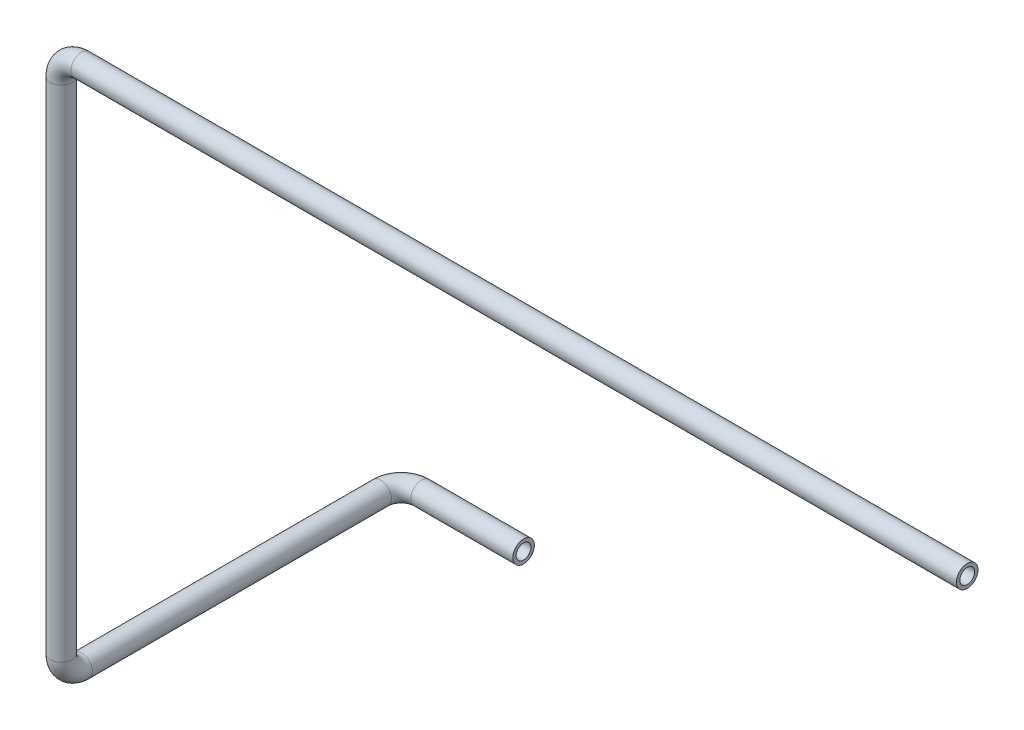
ISO-10303-21;
HEADER;
FILE_DESCRIPTION(('STEP AP214'),'2;1');
FILE_NAME('part.step','',(''),(''),'','','');
FILE_SCHEMA(('AUTOMOTIVE_DESIGN { 1 0 10303 214 1 1 1 1 }'));
ENDSEC;
DATA;
#1=APPLICATION_CONTEXT('core data for automotive mechanical design processes');
#2=APPLICATION_PROTOCOL_DEFINITION('international standard','automotive_design',2000,#1);
#3=PRODUCT_CONTEXT('',#1,'mechanical');
#4=PRODUCT('Part','Part','',(#3));
#5=PRODUCT_RELATED_PRODUCT_CATEGORY('part','',(#4));
#6=PRODUCT_DEFINITION_FORMATION('','',#4);
#7=PRODUCT_DEFINITION_CONTEXT('part definition',#1,'design');
#8=PRODUCT_DEFINITION('design','',#6,#7);
#9=PRODUCT_DEFINITION_SHAPE('','',#8);
#10=(LENGTH_UNIT() NAMED_UNIT(*) SI_UNIT(.MILLI.,.METRE.));
#11=(NAMED_UNIT(*) PLANE_ANGLE_UNIT() SI_UNIT($,.RADIAN.));
#12=(NAMED_UNIT(*) SI_UNIT($,.STERADIAN.) SOLID_ANGLE_UNIT());
#13=UNCERTAINTY_MEASURE_WITH_UNIT(LENGTH_MEASURE(1.E-05),#10,'distance_accuracy_value','');
#14=(GEOMETRIC_REPRESENTATION_CONTEXT(3) GLOBAL_UNCERTAINTY_ASSIGNED_CONTEXT((#13)) GLOBAL_UNIT_ASSIGNED_CONTEXT((#10,
#11,#12)) REPRESENTATION_CONTEXT('',''));
#15=CARTESIAN_POINT('',(0.,0.,0.));
#16=DIRECTION('',(0.,0.,1.));
#17=DIRECTION('',(1.,0.,0.));
#18=AXIS2_PLACEMENT_3D('',#15,#16,#17);
#19=CARTESIAN_POINT('',(76.5,326.,150.));
#20=DIRECTION('',(1.,0.,0.));
#21=DIRECTION('',(0.,-1.,0.));
#22=AXIS2_PLACEMENT_3D('',#19,#20,#21);
#23=PLANE('',#22);
#24=CARTESIAN_POINT('',(76.5,326.,150.));
#25=DIRECTION('',(1.,0.,0.));
#26=DIRECTION('',(0.,-1.,0.));
#27=AXIS2_PLACEMENT_3D('',#24,#25,#26);
#28=CIRCLE('',#27,2.175);
#29=CARTESIAN_POINT('',(76.5,323.825,150.));
#30=VERTEX_POINT('',#29);
#31=EDGE_CURVE('E263',#30,#30,#28,.T.);
#32=ORIENTED_EDGE('',*,*,#31,.F.);
#33=EDGE_LOOP('',(#32));
#34=FACE_BOUND('',#33,.T.);
#35=CARTESIAN_POINT('',(76.5,326.,150.));
#36=DIRECTION('',(1.,0.,0.));
#37=DIRECTION('',(0.,0.,-1.));
#38=AXIS2_PLACEMENT_3D('',#35,#36,#37);
#39=CIRCLE('',#38,3.175);
#40=CARTESIAN_POINT('',(76.5,326.,146.825));
#41=VERTEX_POINT('',#40);
#42=EDGE_CURVE('E75',#41,#41,#39,.T.);
#43=ORIENTED_EDGE('',*,*,#42,.T.);
#44=EDGE_LOOP('',(#43));
#45=FACE_BOUND('',#44,.T.);
#46=ADVANCED_FACE('F52',(#34,#45),#23,.T.);
#47=CARTESIAN_POINT('',(-154.,167.,50.));
#48=DIRECTION('',(-1.,0.,0.));
#49=DIRECTION('',(0.,0.,1.));
#50=AXIS2_PLACEMENT_3D('',#47,#48,#49);
#51=PLANE('',#50);
#52=CARTESIAN_POINT('',(-154.,167.,50.));
#53=DIRECTION('',(-1.,0.,0.));
#54=DIRECTION('',(0.,0.,1.));
#55=AXIS2_PLACEMENT_3D('',#52,#53,#54);
#56=CIRCLE('',#55,2.175);
#57=CARTESIAN_POINT('',(-154.,167.,52.175));
#58=VERTEX_POINT('',#57);
#59=EDGE_CURVE('E73',#58,#58,#56,.T.);
#60=ORIENTED_EDGE('',*,*,#59,.T.);
#61=EDGE_LOOP('',(#60));
#62=FACE_BOUND('',#61,.T.);
#63=CARTESIAN_POINT('',(-154.,167.,50.));
#64=DIRECTION('',(-1.,0.,0.));
#65=DIRECTION('',(0.,0.,1.));
#66=AXIS2_PLACEMENT_3D('',#63,#64,#65);
#67=CIRCLE('',#66,3.175);
#68=CARTESIAN_POINT('',(-154.,167.,53.175));
#69=VERTEX_POINT('',#68);
#70=EDGE_CURVE('E11',#69,#69,#67,.T.);
#71=ORIENTED_EDGE('',*,*,#70,.F.);
#72=EDGE_LOOP('',(#71));
#73=FACE_BOUND('',#72,.T.);
#74=ADVANCED_FACE('F149',(#62,#73),#51,.F.);
#75=CARTESIAN_POINT('',(76.5,326.,150.));
#76=DIRECTION('',(-1.,0.,0.));
#77=DIRECTION('',(0.,0.,1.));
#78=AXIS2_PLACEMENT_3D('',#75,#76,#77);
#79=CYLINDRICAL_SURFACE('',#78,3.175);
#80=CARTESIAN_POINT('',(-184.,326.,150.));
#81=DIRECTION('',(-1.,0.,0.));
#82=DIRECTION('',(0.,0.,1.));
#83=AXIS2_PLACEMENT_3D('',#80,#81,#82);
#84=CIRCLE('',#83,3.175);
#85=CARTESIAN_POINT('',(-184.,329.175,150.));
#86=VERTEX_POINT('',#85);
#87=EDGE_CURVE('E74',#86,#86,#84,.F.);
#88=ORIENTED_EDGE('',*,*,#87,.T.);
#89=EDGE_LOOP('',(#88));
#90=FACE_BOUND('',#89,.T.);
#91=ORIENTED_EDGE('',*,*,#42,.F.);
#92=EDGE_LOOP('',(#91));
#93=FACE_BOUND('',#92,.T.);
#94=ADVANCED_FACE('F155',(#90,#93),#79,.T.);
#95=CARTESIAN_POINT('',(-184.,320.,150.));
#96=DIRECTION('',(0.,0.,1.));
#97=DIRECTION('',(1.,0.,0.));
#98=AXIS2_PLACEMENT_3D('',#95,#96,#97);
#99=TOROIDAL_SURFACE('',#98,6.00000000000001,3.175);
#100=CARTESIAN_POINT('',(-190.,320.,150.));
#101=DIRECTION('',(0.,1.,0.));
#102=DIRECTION('',(-1.,0.,0.));
#103=AXIS2_PLACEMENT_3D('',#100,#101,#102);
#104=CIRCLE('',#103,3.175);
#105=CARTESIAN_POINT('',(-193.175,320.,150.));
#106=VERTEX_POINT('',#105);
#107=EDGE_CURVE('E78',#106,#106,#104,.T.);
#108=CARTESIAN_POINT('',(-184.,320.,150.));
#109=DIRECTION('',(0.,0.,1.));
#110=DIRECTION('',(1.,0.,0.));
#111=AXIS2_PLACEMENT_3D('',#108,#109,#110);
#112=CIRCLE('',#111,9.175);
#113=EDGE_CURVE('',#86,#106,#112,.T.);
#114=ORIENTED_EDGE('',*,*,#87,.F.);
#115=ORIENTED_EDGE('',*,*,#107,.T.);
#116=ORIENTED_EDGE('',*,*,#113,.T.);
#117=ORIENTED_EDGE('',*,*,#113,.F.);
#118=EDGE_LOOP('',(#114,#116,#115,#117));
#119=FACE_BOUND('',#118,.T.);
#120=ADVANCED_FACE('F158',(#119),#99,.T.);
#121=CARTESIAN_POINT('',(-190.,320.,150.));
#122=DIRECTION('',(0.,-1.,0.));
#123=DIRECTION('',(0.,0.,-1.));
#124=AXIS2_PLACEMENT_3D('',#121,#122,#123);
#125=CYLINDRICAL_SURFACE('',#124,3.175);
#126=CARTESIAN_POINT('',(-190.,173.,150.));
#127=DIRECTION('',(0.,-1.,0.));
#128=DIRECTION('',(0.,0.,-1.));
#129=AXIS2_PLACEMENT_3D('',#126,#127,#128);
#130=CIRCLE('',#129,3.175);
#131=CARTESIAN_POINT('',(-190.,173.,153.175));
#132=VERTEX_POINT('',#131);
#133=EDGE_CURVE('E91',#132,#132,#130,.F.);
#134=ORIENTED_EDGE('',*,*,#133,.T.);
#135=EDGE_LOOP('',(#134));
#136=FACE_BOUND('',#135,.T.);
#137=ORIENTED_EDGE('',*,*,#107,.F.);
#138=EDGE_LOOP('',(#137));
#139=FACE_BOUND('',#138,.T.);
#140=ADVANCED_FACE('F109',(#136,#139),#125,.T.);
#141=CARTESIAN_POINT('',(-190.,173.,144.));
#142=DIRECTION('',(1.,0.,0.));
#143=DIRECTION('',(0.,0.,-1.));
#144=AXIS2_PLACEMENT_3D('',#141,#142,#143);
#145=TOROIDAL_SURFACE('',#144,6.00000000000001,3.175);
#146=CARTESIAN_POINT('',(-190.,167.,144.));
#147=DIRECTION('',(0.,0.,1.));
#148=DIRECTION('',(0.,-1.,0.));
#149=AXIS2_PLACEMENT_3D('',#146,#147,#148);
#150=CIRCLE('',#149,3.175);
#151=CARTESIAN_POINT('',(-190.,163.825,144.));
#152=VERTEX_POINT('',#151);
#153=EDGE_CURVE('E68',#152,#152,#150,.T.);
#154=CARTESIAN_POINT('',(-190.,173.,144.));
#155=DIRECTION('',(1.,0.,0.));
#156=DIRECTION('',(0.,0.,-1.));
#157=AXIS2_PLACEMENT_3D('',#154,#155,#156);
#158=CIRCLE('',#157,9.175);
#159=EDGE_CURVE('',#132,#152,#158,.T.);
#160=ORIENTED_EDGE('',*,*,#133,.F.);
#161=ORIENTED_EDGE('',*,*,#153,.T.);
#162=ORIENTED_EDGE('',*,*,#159,.T.);
#163=ORIENTED_EDGE('',*,*,#159,.F.);
#164=EDGE_LOOP('',(#160,#162,#161,#163));
#165=FACE_BOUND('',#164,.T.);
#166=ADVANCED_FACE('F98',(#165),#145,.T.);
#167=CARTESIAN_POINT('',(-190.,167.,144.));
#168=DIRECTION('',(0.,0.,-1.));
#169=DIRECTION('',(-1.,0.,0.));
#170=AXIS2_PLACEMENT_3D('',#167,#168,#169);
#171=CYLINDRICAL_SURFACE('',#170,3.175);
#172=CARTESIAN_POINT('',(-190.,167.,56.));
#173=DIRECTION('',(0.,0.,-1.));
#174=DIRECTION('',(-1.,0.,0.));
#175=AXIS2_PLACEMENT_3D('',#172,#173,#174);
#176=CIRCLE('',#175,3.175);
#177=CARTESIAN_POINT('',(-193.175,167.,56.));
#178=VERTEX_POINT('',#177);
#179=EDGE_CURVE('E63',#178,#178,#176,.F.);
#180=ORIENTED_EDGE('',*,*,#179,.T.);
#181=EDGE_LOOP('',(#180));
#182=FACE_BOUND('',#181,.T.);
#183=ORIENTED_EDGE('',*,*,#153,.F.);
#184=EDGE_LOOP('',(#183));
#185=FACE_BOUND('',#184,.T.);
#186=ADVANCED_FACE('F101',(#182,#185),#171,.T.);
#187=CARTESIAN_POINT('',(-184.,167.,56.));
#188=DIRECTION('',(0.,-1.,0.));
#189=DIRECTION('',(0.,0.,-1.));
#190=AXIS2_PLACEMENT_3D('',#187,#188,#189);
#191=TOROIDAL_SURFACE('',#190,6.00000000000001,3.175);
#192=CARTESIAN_POINT('',(-184.,167.,50.));
#193=DIRECTION('',(-1.,0.,0.));
#194=DIRECTION('',(0.,0.,1.));
#195=AXIS2_PLACEMENT_3D('',#192,#193,#194);
#196=CIRCLE('',#195,3.175);
#197=CARTESIAN_POINT('',(-184.,167.,46.825));
#198=VERTEX_POINT('',#197);
#199=EDGE_CURVE('E58',#198,#198,#196,.T.);
#200=CARTESIAN_POINT('',(-184.,167.,56.));
#201=DIRECTION('',(0.,-1.,0.));
#202=DIRECTION('',(0.,0.,-1.));
#203=AXIS2_PLACEMENT_3D('',#200,#201,#202);
#204=CIRCLE('',#203,9.175);
#205=EDGE_CURVE('',#178,#198,#204,.T.);
#206=ORIENTED_EDGE('',*,*,#179,.F.);
#207=ORIENTED_EDGE('',*,*,#199,.T.);
#208=ORIENTED_EDGE('',*,*,#205,.T.);
#209=ORIENTED_EDGE('',*,*,#205,.F.);
#210=EDGE_LOOP('',(#206,#208,#207,#209));
#211=FACE_BOUND('',#210,.T.);
#212=ADVANCED_FACE('F103',(#211),#191,.T.);
#213=CARTESIAN_POINT('',(-184.,167.,50.));
#214=DIRECTION('',(1.,0.,0.));
#215=DIRECTION('',(0.,0.,-1.));
#216=AXIS2_PLACEMENT_3D('',#213,#214,#215);
#217=CYLINDRICAL_SURFACE('',#216,3.175);
#218=ORIENTED_EDGE('',*,*,#70,.T.);
#219=EDGE_LOOP('',(#218));
#220=FACE_BOUND('',#219,.T.);
#221=ORIENTED_EDGE('',*,*,#199,.F.);
#222=EDGE_LOOP('',(#221));
#223=FACE_BOUND('',#222,.T.);
#224=ADVANCED_FACE('F54',(#220,#223),#217,.T.);
#225=CARTESIAN_POINT('',(76.5,326.,150.));
#226=DIRECTION('',(-1.,0.,0.));
#227=DIRECTION('',(0.,0.,1.));
#228=AXIS2_PLACEMENT_3D('',#225,#226,#227);
#229=CYLINDRICAL_SURFACE('',#228,2.175);
#230=CARTESIAN_POINT('',(-184.,326.,150.));
#231=DIRECTION('',(1.,0.,0.));
#232=DIRECTION('',(0.,-1.,0.));
#233=AXIS2_PLACEMENT_3D('',#230,#231,#232);
#234=CIRCLE('',#233,2.175);
#235=CARTESIAN_POINT('',(-184.,328.175,150.));
#236=VERTEX_POINT('',#235);
#237=EDGE_CURVE('E262',#236,#236,#234,.T.);
#238=ORIENTED_EDGE('',*,*,#237,.F.);
#239=EDGE_LOOP('',(#238));
#240=FACE_BOUND('',#239,.T.);
#241=ORIENTED_EDGE('',*,*,#31,.T.);
#242=EDGE_LOOP('',(#241));
#243=FACE_BOUND('',#242,.T.);
#244=ADVANCED_FACE('F114',(#240,#243),#229,.F.);
#245=CARTESIAN_POINT('',(-184.,320.,150.));
#246=DIRECTION('',(0.,0.,1.));
#247=DIRECTION('',(1.,0.,0.));
#248=AXIS2_PLACEMENT_3D('',#245,#246,#247);
#249=TOROIDAL_SURFACE('',#248,6.00000000000001,2.175);
#250=CARTESIAN_POINT('',(-190.,320.,150.));
#251=DIRECTION('',(0.,1.,0.));
#252=DIRECTION('',(1.,0.,0.));
#253=AXIS2_PLACEMENT_3D('',#250,#251,#252);
#254=CIRCLE('',#253,2.175);
#255=CARTESIAN_POINT('',(-192.175,320.,150.));
#256=VERTEX_POINT('',#255);
#257=EDGE_CURVE('E270',#256,#256,#254,.T.);
#258=CARTESIAN_POINT('',(-184.,320.,150.));
#259=DIRECTION('',(0.,0.,1.));
#260=DIRECTION('',(1.,0.,0.));
#261=AXIS2_PLACEMENT_3D('',#258,#259,#260);
#262=CIRCLE('',#261,8.175);
#263=EDGE_CURVE('',#236,#256,#262,.T.);
#264=ORIENTED_EDGE('',*,*,#237,.T.);
#265=ORIENTED_EDGE('',*,*,#257,.F.);
#266=ORIENTED_EDGE('',*,*,#263,.T.);
#267=ORIENTED_EDGE('',*,*,#263,.F.);
#268=EDGE_LOOP('',(#264,#266,#265,#267));
#269=FACE_BOUND('',#268,.T.);
#270=ADVANCED_FACE('F116',(#269),#249,.F.);
#271=CARTESIAN_POINT('',(-190.,320.,150.));
#272=DIRECTION('',(0.,-1.,0.));
#273=DIRECTION('',(0.,0.,-1.));
#274=AXIS2_PLACEMENT_3D('',#271,#272,#273);
#275=CYLINDRICAL_SURFACE('',#274,2.175);
#276=CARTESIAN_POINT('',(-190.,173.,150.));
#277=DIRECTION('',(0.,1.,0.));
#278=DIRECTION('',(1.,0.,0.));
#279=AXIS2_PLACEMENT_3D('',#276,#277,#278);
#280=CIRCLE('',#279,2.175);
#281=CARTESIAN_POINT('',(-190.,173.,152.175));
#282=VERTEX_POINT('',#281);
#283=EDGE_CURVE('E275',#282,#282,#280,.T.);
#284=ORIENTED_EDGE('',*,*,#283,.F.);
#285=EDGE_LOOP('',(#284));
#286=FACE_BOUND('',#285,.T.);
#287=ORIENTED_EDGE('',*,*,#257,.T.);
#288=EDGE_LOOP('',(#287));
#289=FACE_BOUND('',#288,.T.);
#290=ADVANCED_FACE('F123',(#286,#289),#275,.F.);
#291=CARTESIAN_POINT('',(-190.,173.,144.));
#292=DIRECTION('',(1.,0.,0.));
#293=DIRECTION('',(0.,0.,-1.));
#294=AXIS2_PLACEMENT_3D('',#291,#292,#293);
#295=TOROIDAL_SURFACE('',#294,6.00000000000001,2.175);
#296=CARTESIAN_POINT('',(-190.,167.,144.));
#297=DIRECTION('',(0.,0.,1.));
#298=DIRECTION('',(1.,0.,0.));
#299=AXIS2_PLACEMENT_3D('',#296,#297,#298);
#300=CIRCLE('',#299,2.175);
#301=CARTESIAN_POINT('',(-190.,164.825,144.));
#302=VERTEX_POINT('',#301);
#303=EDGE_CURVE('E274',#302,#302,#300,.T.);
#304=CARTESIAN_POINT('',(-190.,173.,144.));
#305=DIRECTION('',(1.,0.,0.));
#306=DIRECTION('',(0.,0.,-1.));
#307=AXIS2_PLACEMENT_3D('',#304,#305,#306);
#308=CIRCLE('',#307,8.175);
#309=EDGE_CURVE('',#282,#302,#308,.T.);
#310=ORIENTED_EDGE('',*,*,#283,.T.);
#311=ORIENTED_EDGE('',*,*,#303,.F.);
#312=ORIENTED_EDGE('',*,*,#309,.T.);
#313=ORIENTED_EDGE('',*,*,#309,.F.);
#314=EDGE_LOOP('',(#310,#312,#311,#313));
#315=FACE_BOUND('',#314,.T.);
#316=ADVANCED_FACE('F131',(#315),#295,.F.);
#317=CARTESIAN_POINT('',(-190.,167.,144.));
#318=DIRECTION('',(0.,0.,-1.));
#319=DIRECTION('',(-1.,0.,0.));
#320=AXIS2_PLACEMENT_3D('',#317,#318,#319);
#321=CYLINDRICAL_SURFACE('',#320,2.175);
#322=CARTESIAN_POINT('',(-190.,167.,56.));
#323=DIRECTION('',(0.,0.,1.));
#324=DIRECTION('',(1.,0.,0.));
#325=AXIS2_PLACEMENT_3D('',#322,#323,#324);
#326=CIRCLE('',#325,2.175);
#327=CARTESIAN_POINT('',(-192.175,167.,56.));
#328=VERTEX_POINT('',#327);
#329=EDGE_CURVE('E87',#328,#328,#326,.T.);
#330=ORIENTED_EDGE('',*,*,#329,.F.);
#331=EDGE_LOOP('',(#330));
#332=FACE_BOUND('',#331,.T.);
#333=ORIENTED_EDGE('',*,*,#303,.T.);
#334=EDGE_LOOP('',(#333));
#335=FACE_BOUND('',#334,.T.);
#336=ADVANCED_FACE('F136',(#332,#335),#321,.F.);
#337=CARTESIAN_POINT('',(-184.,167.,56.));
#338=DIRECTION('',(0.,-1.,0.));
#339=DIRECTION('',(0.,0.,-1.));
#340=AXIS2_PLACEMENT_3D('',#337,#338,#339);
#341=TOROIDAL_SURFACE('',#340,6.00000000000001,2.175);
#342=CARTESIAN_POINT('',(-184.,167.,50.));
#343=DIRECTION('',(-1.,0.,0.));
#344=DIRECTION('',(0.,0.,1.));
#345=AXIS2_PLACEMENT_3D('',#342,#343,#344);
#346=CIRCLE('',#345,2.175);
#347=CARTESIAN_POINT('',(-184.,167.,47.825));
#348=VERTEX_POINT('',#347);
#349=EDGE_CURVE('E85',#348,#348,#346,.T.);
#350=CARTESIAN_POINT('',(-184.,167.,56.));
#351=DIRECTION('',(0.,-1.,0.));
#352=DIRECTION('',(0.,0.,-1.));
#353=AXIS2_PLACEMENT_3D('',#350,#351,#352);
#354=CIRCLE('',#353,8.175);
#355=EDGE_CURVE('',#328,#348,#354,.T.);
#356=ORIENTED_EDGE('',*,*,#329,.T.);
#357=ORIENTED_EDGE('',*,*,#349,.F.);
#358=ORIENTED_EDGE('',*,*,#355,.T.);
#359=ORIENTED_EDGE('',*,*,#355,.F.);
#360=EDGE_LOOP('',(#356,#358,#357,#359));
#361=FACE_BOUND('',#360,.T.);
#362=ADVANCED_FACE('F139',(#361),#341,.F.);
#363=CARTESIAN_POINT('',(-184.,167.,50.));
#364=DIRECTION('',(1.,0.,0.));
#365=DIRECTION('',(0.,0.,-1.));
#366=AXIS2_PLACEMENT_3D('',#363,#364,#365);
#367=CYLINDRICAL_SURFACE('',#366,2.175);
#368=ORIENTED_EDGE('',*,*,#59,.F.);
#369=EDGE_LOOP('',(#368));
#370=FACE_BOUND('',#369,.T.);
#371=ORIENTED_EDGE('',*,*,#349,.T.);
#372=EDGE_LOOP('',(#371));
#373=FACE_BOUND('',#372,.T.);
#374=ADVANCED_FACE('F145',(#370,#373),#367,.F.);
#375=CLOSED_SHELL('',(#46,#74,#94,#120,#140,#166,#186,#212,#224,#244,#270,#290,#316,#336,#362,#374));
#376=MANIFOLD_SOLID_BREP('B2',#375);
#377=ADVANCED_BREP_SHAPE_REPRESENTATION('',(#18,#376),#14);
#378=SHAPE_DEFINITION_REPRESENTATION(#9,#377);
ENDSEC;
END-ISO-10303-21;
